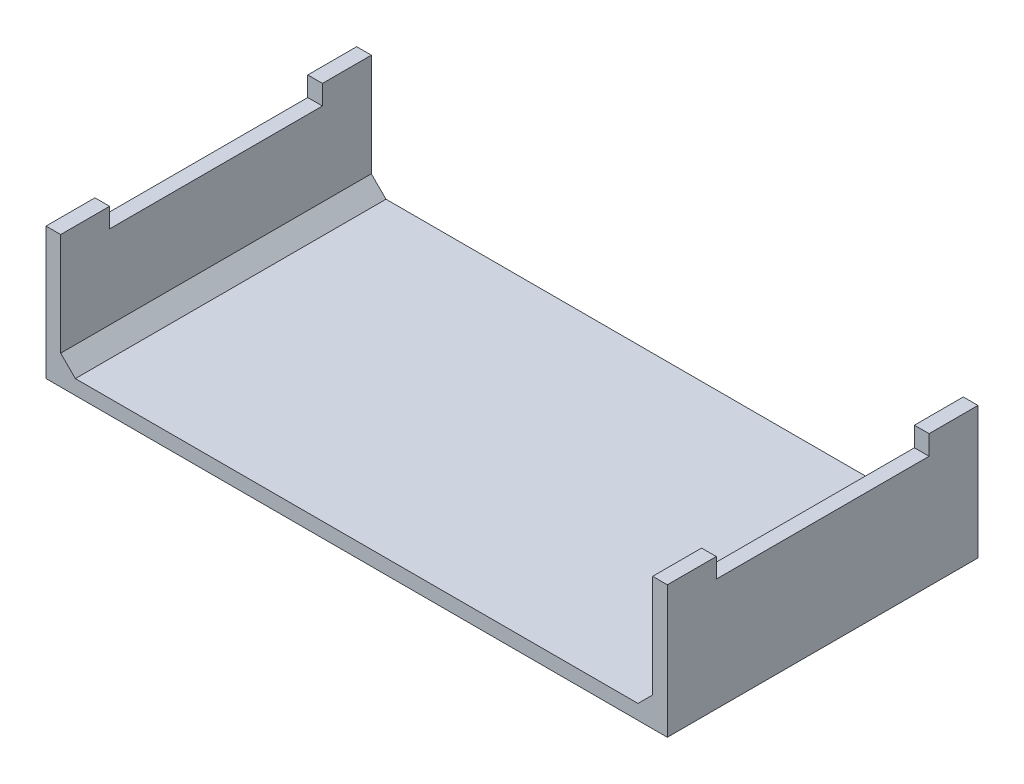
ISO-10303-21;
HEADER;
FILE_DESCRIPTION(('STEP AP214'),'2;1');
FILE_NAME('part.step','',(''),(''),'','','');
FILE_SCHEMA(('AUTOMOTIVE_DESIGN { 1 0 10303 214 1 1 1 1 }'));
ENDSEC;
DATA;
#1=APPLICATION_CONTEXT('core data for automotive mechanical design processes');
#2=APPLICATION_PROTOCOL_DEFINITION('international standard','automotive_design',2000,#1);
#3=PRODUCT_CONTEXT('',#1,'mechanical');
#4=PRODUCT('Part','Part','',(#3));
#5=PRODUCT_RELATED_PRODUCT_CATEGORY('part','',(#4));
#6=PRODUCT_DEFINITION_FORMATION('','',#4);
#7=PRODUCT_DEFINITION_CONTEXT('part definition',#1,'design');
#8=PRODUCT_DEFINITION('design','',#6,#7);
#9=PRODUCT_DEFINITION_SHAPE('','',#8);
#10=(LENGTH_UNIT() NAMED_UNIT(*) SI_UNIT(.MILLI.,.METRE.));
#11=(NAMED_UNIT(*) PLANE_ANGLE_UNIT() SI_UNIT($,.RADIAN.));
#12=(NAMED_UNIT(*) SI_UNIT($,.STERADIAN.) SOLID_ANGLE_UNIT());
#13=UNCERTAINTY_MEASURE_WITH_UNIT(LENGTH_MEASURE(1.E-05),#10,'distance_accuracy_value','');
#14=(GEOMETRIC_REPRESENTATION_CONTEXT(3) GLOBAL_UNCERTAINTY_ASSIGNED_CONTEXT((#13)) GLOBAL_UNIT_ASSIGNED_CONTEXT((#10,
#11,#12)) REPRESENTATION_CONTEXT('',''));
#15=CARTESIAN_POINT('',(0.,0.,0.));
#16=DIRECTION('',(0.,0.,1.));
#17=DIRECTION('',(1.,0.,0.));
#18=AXIS2_PLACEMENT_3D('',#15,#16,#17);
#19=CARTESIAN_POINT('',(0.,23.,0.));
#20=DIRECTION('',(0.,-1.,0.));
#21=DIRECTION('',(0.,0.,-1.));
#22=AXIS2_PLACEMENT_3D('',#19,#20,#21);
#23=PLANE('',#22);
#24=DIRECTION('',(-1.,0.,0.));
#25=VECTOR('',#24,1.);
#26=CARTESIAN_POINT('',(63.5,23.,21.75));
#27=LINE('',#26,#25);
#28=CARTESIAN_POINT('',(63.5,23.,21.75));
#29=VERTEX_POINT('',#28);
#30=CARTESIAN_POINT('',(60.5,23.,21.75));
#31=VERTEX_POINT('',#30);
#32=EDGE_CURVE('E48',#29,#31,#27,.T.);
#33=ORIENTED_EDGE('',*,*,#32,.F.);
#34=DIRECTION('',(0.,0.,-1.));
#35=VECTOR('',#34,1.);
#36=CARTESIAN_POINT('',(63.5,23.,-31.75));
#37=LINE('',#36,#35);
#38=CARTESIAN_POINT('',(63.5,23.,-21.75));
#39=VERTEX_POINT('',#38);
#40=EDGE_CURVE('E179',#29,#39,#37,.T.);
#41=ORIENTED_EDGE('',*,*,#40,.T.);
#42=DIRECTION('',(1.,0.,0.));
#43=VECTOR('',#42,1.);
#44=CARTESIAN_POINT('',(63.5,23.,-21.75));
#45=LINE('',#44,#43);
#46=CARTESIAN_POINT('',(60.5,23.,-21.75));
#47=VERTEX_POINT('',#46);
#48=EDGE_CURVE('E180',#47,#39,#45,.T.);
#49=ORIENTED_EDGE('',*,*,#48,.F.);
#50=DIRECTION('',(0.,0.,1.));
#51=VECTOR('',#50,1.);
#52=CARTESIAN_POINT('',(60.5,23.,-31.75));
#53=LINE('',#52,#51);
#54=EDGE_CURVE('E53',#47,#31,#53,.T.);
#55=ORIENTED_EDGE('',*,*,#54,.T.);
#56=EDGE_LOOP('',(#33,#41,#49,#55));
#57=FACE_BOUND('',#56,.T.);
#58=ADVANCED_FACE('F33',(#57),#23,.F.);
#59=CARTESIAN_POINT('',(0.,23.,0.));
#60=DIRECTION('',(0.,1.,0.));
#61=DIRECTION('',(0.,0.,1.));
#62=AXIS2_PLACEMENT_3D('',#59,#60,#61);
#63=PLANE('',#62);
#64=DIRECTION('',(0.,0.,1.));
#65=VECTOR('',#64,1.);
#66=CARTESIAN_POINT('',(-63.5,23.,-31.75));
#67=LINE('',#66,#65);
#68=CARTESIAN_POINT('',(-63.5,23.,-21.75));
#69=VERTEX_POINT('',#68);
#70=CARTESIAN_POINT('',(-63.5,23.,21.75));
#71=VERTEX_POINT('',#70);
#72=EDGE_CURVE('E247',#69,#71,#67,.T.);
#73=ORIENTED_EDGE('',*,*,#72,.T.);
#74=DIRECTION('',(-1.,0.,0.));
#75=VECTOR('',#74,1.);
#76=CARTESIAN_POINT('',(-63.5,23.,21.75));
#77=LINE('',#76,#75);
#78=CARTESIAN_POINT('',(-60.5,23.,21.75));
#79=VERTEX_POINT('',#78);
#80=EDGE_CURVE('E202',#79,#71,#77,.T.);
#81=ORIENTED_EDGE('',*,*,#80,.F.);
#82=DIRECTION('',(0.,0.,-1.));
#83=VECTOR('',#82,1.);
#84=CARTESIAN_POINT('',(-60.5,23.,-31.75));
#85=LINE('',#84,#83);
#86=CARTESIAN_POINT('',(-60.5,23.,-21.75));
#87=VERTEX_POINT('',#86);
#88=EDGE_CURVE('E249',#79,#87,#85,.T.);
#89=ORIENTED_EDGE('',*,*,#88,.T.);
#90=DIRECTION('',(1.,0.,0.));
#91=VECTOR('',#90,1.);
#92=CARTESIAN_POINT('',(-60.5,23.,-21.75));
#93=LINE('',#92,#91);
#94=EDGE_CURVE('E221',#69,#87,#93,.T.);
#95=ORIENTED_EDGE('',*,*,#94,.F.);
#96=EDGE_LOOP('',(#73,#81,#89,#95));
#97=FACE_BOUND('',#96,.T.);
#98=ADVANCED_FACE('F344',(#97),#63,.T.);
#99=CARTESIAN_POINT('',(0.,3.,0.));
#100=DIRECTION('',(0.,1.,0.));
#101=DIRECTION('',(0.,0.,1.));
#102=AXIS2_PLACEMENT_3D('',#99,#100,#101);
#103=PLANE('',#102);
#104=DIRECTION('',(1.,0.,0.));
#105=VECTOR('',#104,1.);
#106=CARTESIAN_POINT('',(-63.5,3.,31.75));
#107=LINE('',#106,#105);
#108=CARTESIAN_POINT('',(-57.5,3.,31.75));
#109=VERTEX_POINT('',#108);
#110=CARTESIAN_POINT('',(57.5,3.,31.75));
#111=VERTEX_POINT('',#110);
#112=EDGE_CURVE('E261',#109,#111,#107,.T.);
#113=ORIENTED_EDGE('',*,*,#112,.T.);
#114=DIRECTION('',(0.,0.,-1.));
#115=VECTOR('',#114,1.);
#116=CARTESIAN_POINT('',(57.5,3.,0.));
#117=LINE('',#116,#115);
#118=CARTESIAN_POINT('',(57.5,3.,-31.75));
#119=VERTEX_POINT('',#118);
#120=EDGE_CURVE('E287',#111,#119,#117,.T.);
#121=ORIENTED_EDGE('',*,*,#120,.T.);
#122=DIRECTION('',(-1.,0.,0.));
#123=VECTOR('',#122,1.);
#124=CARTESIAN_POINT('',(-63.5,3.,-31.75));
#125=LINE('',#124,#123);
#126=CARTESIAN_POINT('',(-57.5,3.,-31.75));
#127=VERTEX_POINT('',#126);
#128=EDGE_CURVE('E258',#119,#127,#125,.T.);
#129=ORIENTED_EDGE('',*,*,#128,.T.);
#130=DIRECTION('',(0.,0.,1.));
#131=VECTOR('',#130,1.);
#132=CARTESIAN_POINT('',(-57.5,3.,0.));
#133=LINE('',#132,#131);
#134=EDGE_CURVE('E285',#127,#109,#133,.T.);
#135=ORIENTED_EDGE('',*,*,#134,.T.);
#136=EDGE_LOOP('',(#113,#121,#129,#135));
#137=FACE_BOUND('',#136,.T.);
#138=ADVANCED_FACE('F304',(#137),#103,.T.);
#139=CARTESIAN_POINT('',(63.5,3.,-31.75));
#140=DIRECTION('',(-1.,0.,0.));
#141=DIRECTION('',(0.,0.,1.));
#142=AXIS2_PLACEMENT_3D('',#139,#140,#141);
#143=PLANE('',#142);
#144=DIRECTION('',(0.,0.,-1.));
#145=VECTOR('',#144,1.);
#146=CARTESIAN_POINT('',(63.5,0.,-31.75));
#147=LINE('',#146,#145);
#148=CARTESIAN_POINT('',(63.5,0.,31.75));
#149=VERTEX_POINT('',#148);
#150=CARTESIAN_POINT('',(63.5,0.,-31.75));
#151=VERTEX_POINT('',#150);
#152=EDGE_CURVE('E257',#149,#151,#147,.T.);
#153=ORIENTED_EDGE('',*,*,#152,.T.);
#154=DIRECTION('',(0.,-1.,0.));
#155=VECTOR('',#154,1.);
#156=CARTESIAN_POINT('',(63.5,3.,-31.75));
#157=LINE('',#156,#155);
#158=CARTESIAN_POINT('',(63.5,27.,-31.75));
#159=VERTEX_POINT('',#158);
#160=EDGE_CURVE('E279',#159,#151,#157,.T.);
#161=ORIENTED_EDGE('',*,*,#160,.F.);
#162=DIRECTION('',(0.,0.,-1.));
#163=VECTOR('',#162,1.);
#164=CARTESIAN_POINT('',(63.5,27.,-31.75));
#165=LINE('',#164,#163);
#166=CARTESIAN_POINT('',(63.5,27.,-21.75));
#167=VERTEX_POINT('',#166);
#168=EDGE_CURVE('E183',#167,#159,#165,.T.);
#169=ORIENTED_EDGE('',*,*,#168,.F.);
#170=DIRECTION('',(0.,-1.,0.));
#171=VECTOR('',#170,1.);
#172=CARTESIAN_POINT('',(63.5,27.,-21.75));
#173=LINE('',#172,#171);
#174=EDGE_CURVE('E196',#167,#39,#173,.T.);
#175=ORIENTED_EDGE('',*,*,#174,.T.);
#176=ORIENTED_EDGE('',*,*,#40,.F.);
#177=DIRECTION('',(0.,-1.,0.));
#178=VECTOR('',#177,1.);
#179=CARTESIAN_POINT('',(63.5,27.,21.75));
#180=LINE('',#179,#178);
#181=CARTESIAN_POINT('',(63.5,27.,21.75));
#182=VERTEX_POINT('',#181);
#183=EDGE_CURVE('E159',#182,#29,#180,.T.);
#184=ORIENTED_EDGE('',*,*,#183,.F.);
#185=DIRECTION('',(0.,0.,-1.));
#186=VECTOR('',#185,1.);
#187=CARTESIAN_POINT('',(63.5,27.,31.75));
#188=LINE('',#187,#186);
#189=CARTESIAN_POINT('',(63.5,27.,31.75));
#190=VERTEX_POINT('',#189);
#191=EDGE_CURVE('E166',#190,#182,#188,.T.);
#192=ORIENTED_EDGE('',*,*,#191,.F.);
#193=DIRECTION('',(0.,-1.,0.));
#194=VECTOR('',#193,1.);
#195=CARTESIAN_POINT('',(63.5,3.,31.75));
#196=LINE('',#195,#194);
#197=EDGE_CURVE('E265',#190,#149,#196,.T.);
#198=ORIENTED_EDGE('',*,*,#197,.T.);
#199=EDGE_LOOP('',(#153,#161,#169,#175,#176,#184,#192,#198));
#200=FACE_BOUND('',#199,.T.);
#201=ADVANCED_FACE('F177',(#200),#143,.F.);
#202=CARTESIAN_POINT('',(-63.5,3.,-31.75));
#203=DIRECTION('',(0.,0.,1.));
#204=DIRECTION('',(1.,0.,0.));
#205=AXIS2_PLACEMENT_3D('',#202,#203,#204);
#206=PLANE('',#205);
#207=DIRECTION('',(-1.,0.,0.));
#208=VECTOR('',#207,1.);
#209=CARTESIAN_POINT('',(-63.5,0.,-31.75));
#210=LINE('',#209,#208);
#211=CARTESIAN_POINT('',(-63.5,0.,-31.75));
#212=VERTEX_POINT('',#211);
#213=EDGE_CURVE('E267',#151,#212,#210,.T.);
#214=ORIENTED_EDGE('',*,*,#213,.T.);
#215=DIRECTION('',(0.,-1.,0.));
#216=VECTOR('',#215,1.);
#217=CARTESIAN_POINT('',(-63.5,3.,-31.75));
#218=LINE('',#217,#216);
#219=CARTESIAN_POINT('',(-63.5,27.,-31.75));
#220=VERTEX_POINT('',#219);
#221=EDGE_CURVE('E276',#220,#212,#218,.T.);
#222=ORIENTED_EDGE('',*,*,#221,.F.);
#223=DIRECTION('',(-1.,0.,0.));
#224=VECTOR('',#223,1.);
#225=CARTESIAN_POINT('',(-60.5,27.,-31.75));
#226=LINE('',#225,#224);
#227=CARTESIAN_POINT('',(-60.5,27.,-31.75));
#228=VERTEX_POINT('',#227);
#229=EDGE_CURVE('E225',#228,#220,#226,.T.);
#230=ORIENTED_EDGE('',*,*,#229,.F.);
#231=DIRECTION('',(0.,-1.,0.));
#232=VECTOR('',#231,1.);
#233=CARTESIAN_POINT('',(-60.5,23.,-31.75));
#234=LINE('',#233,#232);
#235=CARTESIAN_POINT('',(-60.5,6.00000000000003,-31.75));
#236=VERTEX_POINT('',#235);
#237=EDGE_CURVE('E251',#228,#236,#234,.T.);
#238=ORIENTED_EDGE('',*,*,#237,.T.);
#239=DIRECTION('',(0.707106781186544,-0.707106781186551,0.));
#240=VECTOR('',#239,1.);
#241=CARTESIAN_POINT('',(-60.5,6.,-31.75));
#242=LINE('',#241,#240);
#243=EDGE_CURVE('E41',#236,#127,#242,.T.);
#244=ORIENTED_EDGE('',*,*,#243,.T.);
#245=ORIENTED_EDGE('',*,*,#128,.F.);
#246=DIRECTION('',(0.707106781186544,0.707106781186551,0.));
#247=VECTOR('',#246,1.);
#248=CARTESIAN_POINT('',(-2.99999999999947,-57.5,-31.75));
#249=LINE('',#248,#247);
#250=CARTESIAN_POINT('',(60.5,6.00000000000003,-31.75));
#251=VERTEX_POINT('',#250);
#252=EDGE_CURVE('E294',#119,#251,#249,.T.);
#253=ORIENTED_EDGE('',*,*,#252,.T.);
#254=DIRECTION('',(0.,-1.,0.));
#255=VECTOR('',#254,1.);
#256=CARTESIAN_POINT('',(60.5,23.,-31.75));
#257=LINE('',#256,#255);
#258=CARTESIAN_POINT('',(60.5,27.,-31.75));
#259=VERTEX_POINT('',#258);
#260=EDGE_CURVE('E244',#259,#251,#257,.T.);
#261=ORIENTED_EDGE('',*,*,#260,.F.);
#262=DIRECTION('',(-1.,0.,0.));
#263=VECTOR('',#262,1.);
#264=CARTESIAN_POINT('',(63.5,27.,-31.75));
#265=LINE('',#264,#263);
#266=EDGE_CURVE('E190',#159,#259,#265,.T.);
#267=ORIENTED_EDGE('',*,*,#266,.F.);
#268=ORIENTED_EDGE('',*,*,#160,.T.);
#269=EDGE_LOOP('',(#214,#222,#230,#238,#244,#245,#253,#261,#267,#268));
#270=FACE_BOUND('',#269,.T.);
#271=ADVANCED_FACE('F297',(#270),#206,.F.);
#272=CARTESIAN_POINT('',(-63.5,3.,-31.75));
#273=DIRECTION('',(1.,0.,0.));
#274=DIRECTION('',(0.,0.,-1.));
#275=AXIS2_PLACEMENT_3D('',#272,#273,#274);
#276=PLANE('',#275);
#277=DIRECTION('',(0.,0.,1.));
#278=VECTOR('',#277,1.);
#279=CARTESIAN_POINT('',(-63.5,0.,-31.75));
#280=LINE('',#279,#278);
#281=CARTESIAN_POINT('',(-63.5,0.,31.75));
#282=VERTEX_POINT('',#281);
#283=EDGE_CURVE('E269',#212,#282,#280,.T.);
#284=ORIENTED_EDGE('',*,*,#283,.T.);
#285=DIRECTION('',(0.,-1.,0.));
#286=VECTOR('',#285,1.);
#287=CARTESIAN_POINT('',(-63.5,3.,31.75));
#288=LINE('',#287,#286);
#289=CARTESIAN_POINT('',(-63.5,27.,31.75));
#290=VERTEX_POINT('',#289);
#291=EDGE_CURVE('E273',#290,#282,#288,.T.);
#292=ORIENTED_EDGE('',*,*,#291,.F.);
#293=DIRECTION('',(0.,0.,1.));
#294=VECTOR('',#293,1.);
#295=CARTESIAN_POINT('',(-63.5,27.,31.75));
#296=LINE('',#295,#294);
#297=CARTESIAN_POINT('',(-63.5,27.,21.75));
#298=VERTEX_POINT('',#297);
#299=EDGE_CURVE('E203',#298,#290,#296,.T.);
#300=ORIENTED_EDGE('',*,*,#299,.F.);
#301=DIRECTION('',(0.,-1.,0.));
#302=VECTOR('',#301,1.);
#303=CARTESIAN_POINT('',(-63.5,27.,21.75));
#304=LINE('',#303,#302);
#305=EDGE_CURVE('E213',#298,#71,#304,.T.);
#306=ORIENTED_EDGE('',*,*,#305,.T.);
#307=ORIENTED_EDGE('',*,*,#72,.F.);
#308=DIRECTION('',(0.,-1.,0.));
#309=VECTOR('',#308,1.);
#310=CARTESIAN_POINT('',(-63.5,27.,-21.75));
#311=LINE('',#310,#309);
#312=CARTESIAN_POINT('',(-63.5,27.,-21.75));
#313=VERTEX_POINT('',#312);
#314=EDGE_CURVE('E237',#313,#69,#311,.T.);
#315=ORIENTED_EDGE('',*,*,#314,.F.);
#316=DIRECTION('',(0.,0.,1.));
#317=VECTOR('',#316,1.);
#318=CARTESIAN_POINT('',(-63.5,27.,-31.75));
#319=LINE('',#318,#317);
#320=EDGE_CURVE('E228',#220,#313,#319,.T.);
#321=ORIENTED_EDGE('',*,*,#320,.F.);
#322=ORIENTED_EDGE('',*,*,#221,.T.);
#323=EDGE_LOOP('',(#284,#292,#300,#306,#307,#315,#321,#322));
#324=FACE_BOUND('',#323,.T.);
#325=ADVANCED_FACE('F365',(#324),#276,.F.);
#326=CARTESIAN_POINT('',(-63.5,3.,31.75));
#327=DIRECTION('',(0.,0.,-1.));
#328=DIRECTION('',(-1.,0.,0.));
#329=AXIS2_PLACEMENT_3D('',#326,#327,#328);
#330=PLANE('',#329);
#331=DIRECTION('',(1.,0.,0.));
#332=VECTOR('',#331,1.);
#333=CARTESIAN_POINT('',(-63.5,0.,31.75));
#334=LINE('',#333,#332);
#335=EDGE_CURVE('E262',#282,#149,#334,.T.);
#336=ORIENTED_EDGE('',*,*,#335,.T.);
#337=ORIENTED_EDGE('',*,*,#197,.F.);
#338=DIRECTION('',(1.,0.,0.));
#339=VECTOR('',#338,1.);
#340=CARTESIAN_POINT('',(63.5,27.,31.75));
#341=LINE('',#340,#339);
#342=CARTESIAN_POINT('',(60.5,27.,31.75));
#343=VERTEX_POINT('',#342);
#344=EDGE_CURVE('E172',#343,#190,#341,.T.);
#345=ORIENTED_EDGE('',*,*,#344,.F.);
#346=DIRECTION('',(0.,-1.,0.));
#347=VECTOR('',#346,1.);
#348=CARTESIAN_POINT('',(60.5,23.,31.75));
#349=LINE('',#348,#347);
#350=CARTESIAN_POINT('',(60.5,6.00000000000003,31.75));
#351=VERTEX_POINT('',#350);
#352=EDGE_CURVE('E241',#343,#351,#349,.T.);
#353=ORIENTED_EDGE('',*,*,#352,.T.);
#354=DIRECTION('',(-0.707106781186544,-0.707106781186551,0.));
#355=VECTOR('',#354,1.);
#356=CARTESIAN_POINT('',(-2.99999999999945,-57.5,31.75));
#357=LINE('',#356,#355);
#358=EDGE_CURVE('E292',#351,#111,#357,.T.);
#359=ORIENTED_EDGE('',*,*,#358,.T.);
#360=ORIENTED_EDGE('',*,*,#112,.F.);
#361=DIRECTION('',(-0.707106781186544,0.707106781186551,0.));
#362=VECTOR('',#361,1.);
#363=CARTESIAN_POINT('',(-60.5,5.99999999999999,31.75));
#364=LINE('',#363,#362);
#365=CARTESIAN_POINT('',(-60.5,6.00000000000003,31.75));
#366=VERTEX_POINT('',#365);
#367=EDGE_CURVE('E11',#109,#366,#364,.T.);
#368=ORIENTED_EDGE('',*,*,#367,.T.);
#369=DIRECTION('',(0.,-1.,0.));
#370=VECTOR('',#369,1.);
#371=CARTESIAN_POINT('',(-60.5,23.,31.75));
#372=LINE('',#371,#370);
#373=CARTESIAN_POINT('',(-60.5,27.,31.75));
#374=VERTEX_POINT('',#373);
#375=EDGE_CURVE('E254',#374,#366,#372,.T.);
#376=ORIENTED_EDGE('',*,*,#375,.F.);
#377=DIRECTION('',(1.,0.,0.));
#378=VECTOR('',#377,1.);
#379=CARTESIAN_POINT('',(-63.5,27.,31.75));
#380=LINE('',#379,#378);
#381=EDGE_CURVE('E206',#290,#374,#380,.T.);
#382=ORIENTED_EDGE('',*,*,#381,.F.);
#383=ORIENTED_EDGE('',*,*,#291,.T.);
#384=EDGE_LOOP('',(#336,#337,#345,#353,#359,#360,#368,#376,#382,#383));
#385=FACE_BOUND('',#384,.T.);
#386=ADVANCED_FACE('F309',(#385),#330,.F.);
#387=CARTESIAN_POINT('',(0.,0.,0.));
#388=DIRECTION('',(0.,1.,0.));
#389=DIRECTION('',(0.,0.,1.));
#390=AXIS2_PLACEMENT_3D('',#387,#388,#389);
#391=PLANE('',#390);
#392=ORIENTED_EDGE('',*,*,#152,.F.);
#393=ORIENTED_EDGE('',*,*,#335,.F.);
#394=ORIENTED_EDGE('',*,*,#283,.F.);
#395=ORIENTED_EDGE('',*,*,#213,.F.);
#396=EDGE_LOOP('',(#392,#393,#394,#395));
#397=FACE_BOUND('',#396,.T.);
#398=ADVANCED_FACE('F325',(#397),#391,.F.);
#399=CARTESIAN_POINT('',(-60.5,23.,-31.75));
#400=DIRECTION('',(-1.,0.,0.));
#401=DIRECTION('',(0.,0.,1.));
#402=AXIS2_PLACEMENT_3D('',#399,#400,#401);
#403=PLANE('',#402);
#404=ORIENTED_EDGE('',*,*,#375,.T.);
#405=DIRECTION('',(0.,0.,-1.));
#406=VECTOR('',#405,1.);
#407=CARTESIAN_POINT('',(-60.5,6.00000000000003,-31.75));
#408=LINE('',#407,#406);
#409=EDGE_CURVE('E289',#366,#236,#408,.T.);
#410=ORIENTED_EDGE('',*,*,#409,.T.);
#411=ORIENTED_EDGE('',*,*,#237,.F.);
#412=DIRECTION('',(0.,0.,-1.));
#413=VECTOR('',#412,1.);
#414=CARTESIAN_POINT('',(-60.5,27.,-31.75));
#415=LINE('',#414,#413);
#416=CARTESIAN_POINT('',(-60.5,27.,-21.75));
#417=VERTEX_POINT('',#416);
#418=EDGE_CURVE('E222',#417,#228,#415,.T.);
#419=ORIENTED_EDGE('',*,*,#418,.F.);
#420=DIRECTION('',(0.,-1.,0.));
#421=VECTOR('',#420,1.);
#422=CARTESIAN_POINT('',(-60.5,27.,-21.75));
#423=LINE('',#422,#421);
#424=EDGE_CURVE('E232',#417,#87,#423,.T.);
#425=ORIENTED_EDGE('',*,*,#424,.T.);
#426=ORIENTED_EDGE('',*,*,#88,.F.);
#427=DIRECTION('',(0.,-1.,0.));
#428=VECTOR('',#427,1.);
#429=CARTESIAN_POINT('',(-60.5,27.,21.75));
#430=LINE('',#429,#428);
#431=CARTESIAN_POINT('',(-60.5,27.,21.75));
#432=VERTEX_POINT('',#431);
#433=EDGE_CURVE('E218',#432,#79,#430,.T.);
#434=ORIENTED_EDGE('',*,*,#433,.F.);
#435=DIRECTION('',(0.,0.,-1.));
#436=VECTOR('',#435,1.);
#437=CARTESIAN_POINT('',(-60.5,27.,31.75));
#438=LINE('',#437,#436);
#439=EDGE_CURVE('E209',#374,#432,#438,.T.);
#440=ORIENTED_EDGE('',*,*,#439,.F.);
#441=EDGE_LOOP('',(#404,#410,#411,#419,#425,#426,#434,#440));
#442=FACE_BOUND('',#441,.T.);
#443=ADVANCED_FACE('F313',(#442),#403,.F.);
#444=CARTESIAN_POINT('',(60.5,23.,-31.75));
#445=DIRECTION('',(1.,0.,0.));
#446=DIRECTION('',(0.,0.,-1.));
#447=AXIS2_PLACEMENT_3D('',#444,#445,#446);
#448=PLANE('',#447);
#449=ORIENTED_EDGE('',*,*,#260,.T.);
#450=DIRECTION('',(0.,0.,1.));
#451=VECTOR('',#450,1.);
#452=CARTESIAN_POINT('',(60.5,6.00000000000003,-31.75));
#453=LINE('',#452,#451);
#454=EDGE_CURVE('E282',#251,#351,#453,.T.);
#455=ORIENTED_EDGE('',*,*,#454,.T.);
#456=ORIENTED_EDGE('',*,*,#352,.F.);
#457=DIRECTION('',(0.,0.,1.));
#458=VECTOR('',#457,1.);
#459=CARTESIAN_POINT('',(60.5,27.,31.75));
#460=LINE('',#459,#458);
#461=CARTESIAN_POINT('',(60.5,27.,21.75));
#462=VERTEX_POINT('',#461);
#463=EDGE_CURVE('E165',#462,#343,#460,.T.);
#464=ORIENTED_EDGE('',*,*,#463,.F.);
#465=DIRECTION('',(0.,-1.,0.));
#466=VECTOR('',#465,1.);
#467=CARTESIAN_POINT('',(60.5,27.,21.75));
#468=LINE('',#467,#466);
#469=EDGE_CURVE('E161',#462,#31,#468,.T.);
#470=ORIENTED_EDGE('',*,*,#469,.T.);
#471=ORIENTED_EDGE('',*,*,#54,.F.);
#472=DIRECTION('',(0.,-1.,0.));
#473=VECTOR('',#472,1.);
#474=CARTESIAN_POINT('',(60.5,27.,-21.75));
#475=LINE('',#474,#473);
#476=CARTESIAN_POINT('',(60.5,27.,-21.75));
#477=VERTEX_POINT('',#476);
#478=EDGE_CURVE('E199',#477,#47,#475,.T.);
#479=ORIENTED_EDGE('',*,*,#478,.F.);
#480=DIRECTION('',(0.,0.,1.));
#481=VECTOR('',#480,1.);
#482=CARTESIAN_POINT('',(60.5,27.,-31.75));
#483=LINE('',#482,#481);
#484=EDGE_CURVE('E193',#259,#477,#483,.T.);
#485=ORIENTED_EDGE('',*,*,#484,.F.);
#486=EDGE_LOOP('',(#449,#455,#456,#464,#470,#471,#479,#485));
#487=FACE_BOUND('',#486,.T.);
#488=ADVANCED_FACE('F331',(#487),#448,.F.);
#489=CARTESIAN_POINT('',(60.5,6.00000000000003,-31.75));
#490=DIRECTION('',(0.707106781186551,-0.707106781186544,0.));
#491=DIRECTION('',(0.,0.,1.));
#492=AXIS2_PLACEMENT_3D('',#489,#490,#491);
#493=PLANE('',#492);
#494=ORIENTED_EDGE('',*,*,#252,.F.);
#495=ORIENTED_EDGE('',*,*,#120,.F.);
#496=ORIENTED_EDGE('',*,*,#358,.F.);
#497=ORIENTED_EDGE('',*,*,#454,.F.);
#498=EDGE_LOOP('',(#494,#495,#496,#497));
#499=FACE_BOUND('',#498,.T.);
#500=ADVANCED_FACE('F336',(#499),#493,.F.);
#501=CARTESIAN_POINT('',(-60.5,6.00000000000003,-31.75));
#502=DIRECTION('',(-0.707106781186551,-0.707106781186544,0.));
#503=DIRECTION('',(0.,0.,-1.));
#504=AXIS2_PLACEMENT_3D('',#501,#502,#503);
#505=PLANE('',#504);
#506=ORIENTED_EDGE('',*,*,#367,.F.);
#507=ORIENTED_EDGE('',*,*,#134,.F.);
#508=ORIENTED_EDGE('',*,*,#243,.F.);
#509=ORIENTED_EDGE('',*,*,#409,.F.);
#510=EDGE_LOOP('',(#506,#507,#508,#509));
#511=FACE_BOUND('',#510,.T.);
#512=ADVANCED_FACE('F35',(#511),#505,.F.);
#513=CARTESIAN_POINT('',(-60.5,27.,-21.75));
#514=DIRECTION('',(0.,0.,-1.));
#515=DIRECTION('',(-1.,0.,0.));
#516=AXIS2_PLACEMENT_3D('',#513,#514,#515);
#517=PLANE('',#516);
#518=ORIENTED_EDGE('',*,*,#94,.T.);
#519=ORIENTED_EDGE('',*,*,#424,.F.);
#520=DIRECTION('',(1.,0.,0.));
#521=VECTOR('',#520,1.);
#522=CARTESIAN_POINT('',(-60.5,27.,-21.75));
#523=LINE('',#522,#521);
#524=EDGE_CURVE('E230',#313,#417,#523,.T.);
#525=ORIENTED_EDGE('',*,*,#524,.F.);
#526=ORIENTED_EDGE('',*,*,#314,.T.);
#527=EDGE_LOOP('',(#518,#519,#525,#526));
#528=FACE_BOUND('',#527,.T.);
#529=ADVANCED_FACE('F353',(#528),#517,.F.);
#530=CARTESIAN_POINT('',(0.,27.,0.));
#531=DIRECTION('',(0.,-1.,0.));
#532=DIRECTION('',(0.,0.,-1.));
#533=AXIS2_PLACEMENT_3D('',#530,#531,#532);
#534=PLANE('',#533);
#535=ORIENTED_EDGE('',*,*,#418,.T.);
#536=ORIENTED_EDGE('',*,*,#229,.T.);
#537=ORIENTED_EDGE('',*,*,#320,.T.);
#538=ORIENTED_EDGE('',*,*,#524,.T.);
#539=EDGE_LOOP('',(#535,#536,#537,#538));
#540=FACE_BOUND('',#539,.T.);
#541=ADVANCED_FACE('F378',(#540),#534,.F.);
#542=CARTESIAN_POINT('',(-63.5,27.,21.75));
#543=DIRECTION('',(0.,0.,1.));
#544=DIRECTION('',(1.,0.,0.));
#545=AXIS2_PLACEMENT_3D('',#542,#543,#544);
#546=PLANE('',#545);
#547=ORIENTED_EDGE('',*,*,#80,.T.);
#548=ORIENTED_EDGE('',*,*,#305,.F.);
#549=DIRECTION('',(-1.,0.,0.));
#550=VECTOR('',#549,1.);
#551=CARTESIAN_POINT('',(-63.5,27.,21.75));
#552=LINE('',#551,#550);
#553=EDGE_CURVE('E211',#432,#298,#552,.T.);
#554=ORIENTED_EDGE('',*,*,#553,.F.);
#555=ORIENTED_EDGE('',*,*,#433,.T.);
#556=EDGE_LOOP('',(#547,#548,#554,#555));
#557=FACE_BOUND('',#556,.T.);
#558=ADVANCED_FACE('F383',(#557),#546,.F.);
#559=CARTESIAN_POINT('',(0.,27.,0.));
#560=DIRECTION('',(0.,-1.,0.));
#561=DIRECTION('',(0.,0.,-1.));
#562=AXIS2_PLACEMENT_3D('',#559,#560,#561);
#563=PLANE('',#562);
#564=ORIENTED_EDGE('',*,*,#299,.T.);
#565=ORIENTED_EDGE('',*,*,#381,.T.);
#566=ORIENTED_EDGE('',*,*,#439,.T.);
#567=ORIENTED_EDGE('',*,*,#553,.T.);
#568=EDGE_LOOP('',(#564,#565,#566,#567));
#569=FACE_BOUND('',#568,.T.);
#570=ADVANCED_FACE('F317',(#569),#563,.F.);
#571=CARTESIAN_POINT('',(63.5,27.,-21.75));
#572=DIRECTION('',(0.,0.,-1.));
#573=DIRECTION('',(-1.,0.,0.));
#574=AXIS2_PLACEMENT_3D('',#571,#572,#573);
#575=PLANE('',#574);
#576=ORIENTED_EDGE('',*,*,#48,.T.);
#577=ORIENTED_EDGE('',*,*,#174,.F.);
#578=DIRECTION('',(1.,0.,0.));
#579=VECTOR('',#578,1.);
#580=CARTESIAN_POINT('',(63.5,27.,-21.75));
#581=LINE('',#580,#579);
#582=EDGE_CURVE('E195',#477,#167,#581,.T.);
#583=ORIENTED_EDGE('',*,*,#582,.F.);
#584=ORIENTED_EDGE('',*,*,#478,.T.);
#585=EDGE_LOOP('',(#576,#577,#583,#584));
#586=FACE_BOUND('',#585,.T.);
#587=ADVANCED_FACE('F342',(#586),#575,.F.);
#588=CARTESIAN_POINT('',(0.,27.,0.));
#589=DIRECTION('',(0.,-1.,0.));
#590=DIRECTION('',(0.,0.,-1.));
#591=AXIS2_PLACEMENT_3D('',#588,#589,#590);
#592=PLANE('',#591);
#593=ORIENTED_EDGE('',*,*,#168,.T.);
#594=ORIENTED_EDGE('',*,*,#266,.T.);
#595=ORIENTED_EDGE('',*,*,#484,.T.);
#596=ORIENTED_EDGE('',*,*,#582,.T.);
#597=EDGE_LOOP('',(#593,#594,#595,#596));
#598=FACE_BOUND('',#597,.T.);
#599=ADVANCED_FACE('F338',(#598),#592,.F.);
#600=CARTESIAN_POINT('',(63.5,27.,21.75));
#601=DIRECTION('',(0.,0.,1.));
#602=DIRECTION('',(1.,0.,0.));
#603=AXIS2_PLACEMENT_3D('',#600,#601,#602);
#604=PLANE('',#603);
#605=ORIENTED_EDGE('',*,*,#32,.T.);
#606=ORIENTED_EDGE('',*,*,#469,.F.);
#607=DIRECTION('',(-1.,0.,0.));
#608=VECTOR('',#607,1.);
#609=CARTESIAN_POINT('',(63.5,27.,21.75));
#610=LINE('',#609,#608);
#611=EDGE_CURVE('E155',#182,#462,#610,.T.);
#612=ORIENTED_EDGE('',*,*,#611,.F.);
#613=ORIENTED_EDGE('',*,*,#183,.T.);
#614=EDGE_LOOP('',(#605,#606,#612,#613));
#615=FACE_BOUND('',#614,.T.);
#616=ADVANCED_FACE('F157',(#615),#604,.F.);
#617=CARTESIAN_POINT('',(0.,27.,0.));
#618=DIRECTION('',(0.,1.,0.));
#619=DIRECTION('',(0.,0.,1.));
#620=AXIS2_PLACEMENT_3D('',#617,#618,#619);
#621=PLANE('',#620);
#622=ORIENTED_EDGE('',*,*,#191,.T.);
#623=ORIENTED_EDGE('',*,*,#611,.T.);
#624=ORIENTED_EDGE('',*,*,#463,.T.);
#625=ORIENTED_EDGE('',*,*,#344,.T.);
#626=EDGE_LOOP('',(#622,#623,#624,#625));
#627=FACE_BOUND('',#626,.T.);
#628=ADVANCED_FACE('F170',(#627),#621,.T.);
#629=CLOSED_SHELL('',(#58,#98,#138,#201,#271,#325,#386,#398,#443,#488,#500,#512,#529,#541,#558,
#570,#587,#599,#616,#628));
#630=MANIFOLD_SOLID_BREP('B2',#629);
#631=ADVANCED_BREP_SHAPE_REPRESENTATION('',(#18,#630),#14);
#632=SHAPE_DEFINITION_REPRESENTATION(#9,#631);
ENDSEC;
END-ISO-10303-21;
